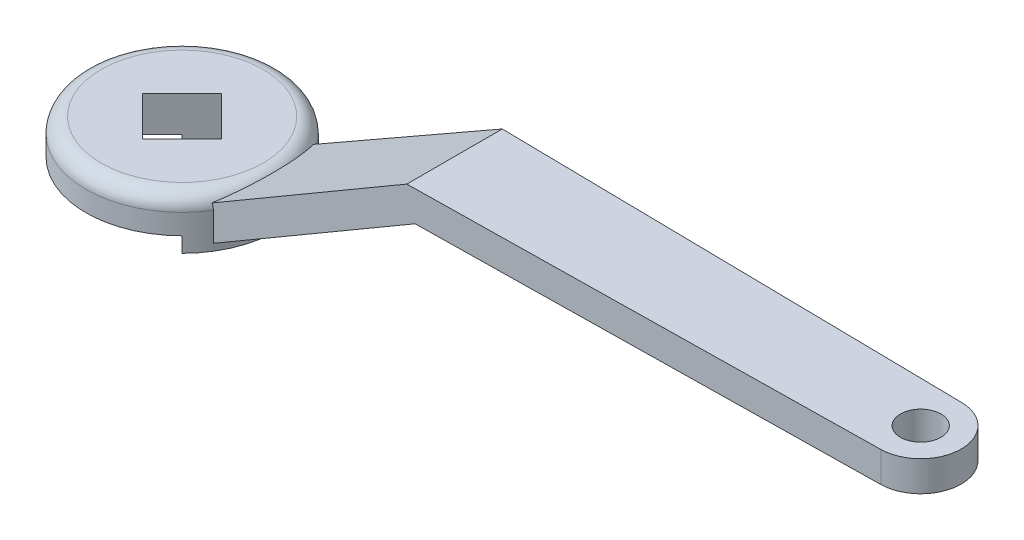
ISO-10303-21;
HEADER;
FILE_DESCRIPTION(('STEP AP214'),'2;1');
FILE_NAME('part.step','',(''),(''),'','','');
FILE_SCHEMA(('AUTOMOTIVE_DESIGN { 1 0 10303 214 1 1 1 1 }'));
ENDSEC;
DATA;
#1=APPLICATION_CONTEXT('core data for automotive mechanical design processes');
#2=APPLICATION_PROTOCOL_DEFINITION('international standard','automotive_design',2000,#1);
#3=PRODUCT_CONTEXT('',#1,'mechanical');
#4=PRODUCT('Part','Part','',(#3));
#5=PRODUCT_RELATED_PRODUCT_CATEGORY('part','',(#4));
#6=PRODUCT_DEFINITION_FORMATION('','',#4);
#7=PRODUCT_DEFINITION_CONTEXT('part definition',#1,'design');
#8=PRODUCT_DEFINITION('design','',#6,#7);
#9=PRODUCT_DEFINITION_SHAPE('','',#8);
#10=(LENGTH_UNIT() NAMED_UNIT(*) SI_UNIT(.MILLI.,.METRE.));
#11=(NAMED_UNIT(*) PLANE_ANGLE_UNIT() SI_UNIT($,.RADIAN.));
#12=(NAMED_UNIT(*) SI_UNIT($,.STERADIAN.) SOLID_ANGLE_UNIT());
#13=UNCERTAINTY_MEASURE_WITH_UNIT(LENGTH_MEASURE(1.E-05),#10,'distance_accuracy_value','');
#14=(GEOMETRIC_REPRESENTATION_CONTEXT(3) GLOBAL_UNCERTAINTY_ASSIGNED_CONTEXT((#13)) GLOBAL_UNIT_ASSIGNED_CONTEXT((#10,
#11,#12)) REPRESENTATION_CONTEXT('',''));
#15=CARTESIAN_POINT('',(0.,0.,0.));
#16=DIRECTION('',(0.,0.,1.));
#17=DIRECTION('',(1.,0.,0.));
#18=AXIS2_PLACEMENT_3D('',#15,#16,#17);
#19=CARTESIAN_POINT('',(-7.77817459305202,0.,0.));
#20=DIRECTION('',(-0.707106781186547,0.,0.707106781186548));
#21=DIRECTION('',(0.707106781186548,0.,0.707106781186547));
#22=AXIS2_PLACEMENT_3D('',#19,#20,#21);
#23=PLANE('',#22);
#24=DIRECTION('',(0.,1.,0.));
#25=VECTOR('',#24,1.);
#26=CARTESIAN_POINT('',(0.,0.,7.77817459305202));
#27=LINE('',#26,#25);
#28=CARTESIAN_POINT('',(0.,3.,7.77817459305202));
#29=VERTEX_POINT('',#28);
#30=CARTESIAN_POINT('',(0.,10.,7.77817459305202));
#31=VERTEX_POINT('',#30);
#32=EDGE_CURVE('E283',#29,#31,#27,.T.);
#33=ORIENTED_EDGE('',*,*,#32,.F.);
#34=DIRECTION('',(-0.707106781186548,0.,-0.707106781186547));
#35=VECTOR('',#34,1.);
#36=CARTESIAN_POINT('',(-3.88908729652601,3.,3.88908729652601));
#37=LINE('',#36,#35);
#38=CARTESIAN_POINT('',(-7.77817459305202,3.,0.));
#39=VERTEX_POINT('',#38);
#40=EDGE_CURVE('E32',#29,#39,#37,.T.);
#41=ORIENTED_EDGE('',*,*,#40,.T.);
#42=DIRECTION('',(0.,1.,0.));
#43=VECTOR('',#42,1.);
#44=CARTESIAN_POINT('',(-7.77817459305202,0.,0.));
#45=LINE('',#44,#43);
#46=CARTESIAN_POINT('',(-7.77817459305202,10.,0.));
#47=VERTEX_POINT('',#46);
#48=EDGE_CURVE('E265',#39,#47,#45,.T.);
#49=ORIENTED_EDGE('',*,*,#48,.T.);
#50=DIRECTION('',(0.707106781186548,0.,0.707106781186547));
#51=VECTOR('',#50,1.);
#52=CARTESIAN_POINT('',(-7.77817459305202,10.,0.));
#53=LINE('',#52,#51);
#54=EDGE_CURVE('E276',#47,#31,#53,.T.);
#55=ORIENTED_EDGE('',*,*,#54,.T.);
#56=EDGE_LOOP('',(#33,#41,#49,#55));
#57=FACE_BOUND('',#56,.T.);
#58=ADVANCED_FACE('F16',(#57),#23,.F.);
#59=CARTESIAN_POINT('',(13.8038475772934,0.,10.));
#60=DIRECTION('',(-0.5,0.866025403784438,0.));
#61=DIRECTION('',(-0.866025403784438,-0.5,0.));
#62=AXIS2_PLACEMENT_3D('',#59,#60,#61);
#63=PLANE('',#62);
#64=DIRECTION('',(0.,0.,-1.));
#65=VECTOR('',#64,1.);
#66=CARTESIAN_POINT('',(55.3730669589463,24.,10.));
#67=LINE('',#66,#65);
#68=CARTESIAN_POINT('',(55.3730669589463,24.,9.39512457310106));
#69=VERTEX_POINT('',#68);
#70=CARTESIAN_POINT('',(55.3730669589463,24.,-9.39512457310106));
#71=VERTEX_POINT('',#70);
#72=EDGE_CURVE('E197',#69,#71,#67,.T.);
#73=ORIENTED_EDGE('',*,*,#72,.F.);
#74=DIRECTION('',(-0.865948158094437,-0.499955402180085,0.0133560220051432));
#75=VECTOR('',#74,1.);
#76=CARTESIAN_POINT('',(13.8042670718738,0.000242195308952484,10.0362643466885));
#77=LINE('',#76,#75);
#78=CARTESIAN_POINT('',(16.1554944214035,1.35772393848592,10.));
#79=VERTEX_POINT('',#78);
#80=EDGE_CURVE('E184',#69,#79,#77,.T.);
#81=ORIENTED_EDGE('',*,*,#80,.T.);
#82=CARTESIAN_POINT('',(0.,-7.96965511460292,0.));
#83=DIRECTION('',(-0.5,0.866025403784438,0.));
#84=DIRECTION('',(-0.866025403784438,-0.5,0.));
#85=AXIS2_PLACEMENT_3D('',#82,#83,#84);
#86=ELLIPSE('',#85,21.9393102292058,19.);
#87=CARTESIAN_POINT('',(16.1554944214035,1.35772393848592,-10.));
#88=VERTEX_POINT('',#87);
#89=EDGE_CURVE('E189',#88,#79,#86,.F.);
#90=ORIENTED_EDGE('',*,*,#89,.F.);
#91=DIRECTION('',(0.865948158094437,0.499955402180085,0.0133560220051432));
#92=VECTOR('',#91,1.);
#93=CARTESIAN_POINT('',(14.0355795249703,0.133790502371101,-10.0326966802125));
#94=LINE('',#93,#92);
#95=EDGE_CURVE('E175',#88,#71,#94,.T.);
#96=ORIENTED_EDGE('',*,*,#95,.T.);
#97=EDGE_LOOP('',(#73,#81,#90,#96));
#98=FACE_BOUND('',#97,.T.);
#99=ADVANCED_FACE('F316',(#98),#63,.F.);
#100=CARTESIAN_POINT('',(55.3730669589463,24.,10.));
#101=DIRECTION('',(0.,1.,0.));
#102=DIRECTION('',(0.,0.,1.));
#103=AXIS2_PLACEMENT_3D('',#100,#101,#102);
#104=PLANE('',#103);
#105=CARTESIAN_POINT('',(145.76537180436,24.,0.));
#106=DIRECTION('',(0.,1.,0.));
#107=DIRECTION('',(0.,0.,1.));
#108=AXIS2_PLACEMENT_3D('',#105,#106,#107);
#109=CIRCLE('',#108,4.);
#110=CARTESIAN_POINT('',(145.76537180436,24.,4.));
#111=VERTEX_POINT('',#110);
#112=EDGE_CURVE('E273',#111,#111,#109,.T.);
#113=ORIENTED_EDGE('',*,*,#112,.T.);
#114=EDGE_LOOP('',(#113));
#115=FACE_BOUND('',#114,.T.);
#116=CARTESIAN_POINT('',(145.76537180436,24.,0.));
#117=DIRECTION('',(0.,1.,0.));
#118=DIRECTION('',(0.,0.,1.));
#119=AXIS2_PLACEMENT_3D('',#116,#117,#118);
#120=CIRCLE('',#119,8.);
#121=CARTESIAN_POINT('',(145.888745782837,24.,-7.9990486222697));
#122=VERTEX_POINT('',#121);
#123=CARTESIAN_POINT('',(145.888745782837,24.,7.9990486222697));
#124=VERTEX_POINT('',#123);
#125=EDGE_CURVE('E187',#122,#124,#120,.F.);
#126=ORIENTED_EDGE('',*,*,#125,.T.);
#127=DIRECTION('',(-0.999881077783712,0.,0.0154217473096689));
#128=VECTOR('',#127,1.);
#129=CARTESIAN_POINT('',(55.3637398322934,24.,9.3952684307993));
#130=LINE('',#129,#128);
#131=EDGE_CURVE('E181',#124,#69,#130,.T.);
#132=ORIENTED_EDGE('',*,*,#131,.T.);
#133=ORIENTED_EDGE('',*,*,#72,.T.);
#134=DIRECTION('',(0.999881077783712,0.,0.0154217473096689));
#135=VECTOR('',#134,1.);
#136=CARTESIAN_POINT('',(55.6721380987193,24.,-9.39051182499764));
#137=LINE('',#136,#135);
#138=EDGE_CURVE('E172',#71,#122,#137,.T.);
#139=ORIENTED_EDGE('',*,*,#138,.T.);
#140=EDGE_LOOP('',(#126,#132,#133,#139));
#141=FACE_BOUND('',#140,.T.);
#142=ADVANCED_FACE('F321',(#115,#141),#104,.F.);
#143=CARTESIAN_POINT('',(53.7653718043596,30.,10.));
#144=DIRECTION('',(0.,-1.,0.));
#145=DIRECTION('',(0.,0.,-1.));
#146=AXIS2_PLACEMENT_3D('',#143,#144,#145);
#147=PLANE('',#146);
#148=CARTESIAN_POINT('',(145.76537180436,30.,0.));
#149=DIRECTION('',(0.,1.,0.));
#150=DIRECTION('',(0.,0.,1.));
#151=AXIS2_PLACEMENT_3D('',#148,#149,#150);
#152=CIRCLE('',#151,4.);
#153=CARTESIAN_POINT('',(145.76537180436,30.,4.));
#154=VERTEX_POINT('',#153);
#155=EDGE_CURVE('E253',#154,#154,#152,.T.);
#156=ORIENTED_EDGE('',*,*,#155,.F.);
#157=EDGE_LOOP('',(#156));
#158=FACE_BOUND('',#157,.T.);
#159=DIRECTION('',(0.,0.,-1.));
#160=VECTOR('',#159,1.);
#161=CARTESIAN_POINT('',(53.7653718043596,30.,10.));
#162=LINE('',#161,#160);
#163=CARTESIAN_POINT('',(53.7653718043595,30.,9.41992099037097));
#164=VERTEX_POINT('',#163);
#165=CARTESIAN_POINT('',(53.7653718043595,30.,-9.41992099037097));
#166=VERTEX_POINT('',#165);
#167=EDGE_CURVE('E194',#164,#166,#162,.T.);
#168=ORIENTED_EDGE('',*,*,#167,.F.);
#169=DIRECTION('',(0.999881077783712,0.,-0.0154217473096689));
#170=VECTOR('',#169,1.);
#171=CARTESIAN_POINT('',(16.1554944214035,30.,10.));
#172=LINE('',#171,#170);
#173=CARTESIAN_POINT('',(145.888745782837,30.,7.9990486222697));
#174=VERTEX_POINT('',#173);
#175=EDGE_CURVE('E150',#164,#174,#172,.T.);
#176=ORIENTED_EDGE('',*,*,#175,.T.);
#177=CARTESIAN_POINT('',(145.76537180436,30.,0.));
#178=DIRECTION('',(0.,1.,0.));
#179=DIRECTION('',(0.,0.,1.));
#180=AXIS2_PLACEMENT_3D('',#177,#178,#179);
#181=CIRCLE('',#180,8.);
#182=CARTESIAN_POINT('',(145.888745782837,30.,-7.99904862226969));
#183=VERTEX_POINT('',#182);
#184=EDGE_CURVE('E154',#174,#183,#181,.T.);
#185=ORIENTED_EDGE('',*,*,#184,.T.);
#186=DIRECTION('',(-0.999881077783712,0.,-0.0154217473096689));
#187=VECTOR('',#186,1.);
#188=CARTESIAN_POINT('',(16.1554944214035,30.,-10.));
#189=LINE('',#188,#187);
#190=EDGE_CURVE('E161',#183,#166,#189,.T.);
#191=ORIENTED_EDGE('',*,*,#190,.T.);
#192=EDGE_LOOP('',(#168,#176,#185,#191));
#193=FACE_BOUND('',#192,.T.);
#194=ADVANCED_FACE('F385',(#158,#193),#147,.F.);
#195=CARTESIAN_POINT('',(10.8038475772934,5.19615242270663,10.));
#196=DIRECTION('',(0.5,-0.866025403784438,0.));
#197=DIRECTION('',(0.866025403784438,0.5,0.));
#198=AXIS2_PLACEMENT_3D('',#195,#196,#197);
#199=PLANE('',#198);
#200=DIRECTION('',(-0.865948158094437,-0.499955402180085,-0.0133560220051432));
#201=VECTOR('',#200,1.);
#202=CARTESIAN_POINT('',(11.0361146749417,5.33025189405778,-10.0789591708318));
#203=LINE('',#202,#201);
#204=CARTESIAN_POINT('',(15.8909461979254,8.13319018072274,-10.0040802810898));
#205=VERTEX_POINT('',#204);
#206=EDGE_CURVE('E170',#166,#205,#203,.T.);
#207=ORIENTED_EDGE('',*,*,#206,.T.);
#208=CARTESIAN_POINT('',(15.8909461979254,8.13319018072274,-10.0040802810898));
#209=CARTESIAN_POINT('',(16.0834714126921,8.24434466529403,-9.6130587844605));
#210=CARTESIAN_POINT('',(16.2600014060128,8.34626430445777,-9.21194413680739));
#211=CARTESIAN_POINT('',(16.5826303672746,8.53253422209069,-8.39450973239651));
#212=CARTESIAN_POINT('',(16.7287821648788,8.61691500177999,-7.97821787762017));
#213=CARTESIAN_POINT('',(16.9928173694254,8.76935579820052,-7.13419768518777));
#214=CARTESIAN_POINT('',(17.1107134026351,8.83742310471049,-6.70647455100184));
#215=CARTESIAN_POINT('',(17.3204025410203,8.95848718520334,-5.84234670886082));
#216=CARTESIAN_POINT('',(17.4121797830036,9.01147480056796,-5.40593689647396));
#217=CARTESIAN_POINT('',(17.5524894099975,9.09248260148273,-4.63230251117251));
#218=CARTESIAN_POINT('',(17.6061149953627,9.12344334762878,-4.29628520625016));
#219=CARTESIAN_POINT('',(17.7001653539011,9.1777433474483,-3.62179448964675));
#220=CARTESIAN_POINT('',(17.7405899512008,9.20108249958117,-3.28332104530456));
#221=CARTESIAN_POINT('',(17.8089558781152,9.24055358588858,-2.60458604487492));
#222=CARTESIAN_POINT('',(17.8368926126035,9.2566828670657,-2.26432387711522));
#223=CARTESIAN_POINT('',(17.8808070723632,9.28203689222929,-1.58278870512594));
#224=CARTESIAN_POINT('',(17.8967851379249,9.29126183268247,-1.24151572993688));
#225=CARTESIAN_POINT('',(17.9171377555138,9.30301242192609,-0.557900570385449));
#226=CARTESIAN_POINT('',(17.9214914945681,9.30552605434109,-0.215557565500221));
#227=CARTESIAN_POINT('',(17.91863089234,9.30387448487468,0.469068033525936));
#228=CARTESIAN_POINT('',(17.9114163717042,9.29970917944349,0.81135062664796));
#229=CARTESIAN_POINT('',(17.8852619770625,9.2846089326566,1.49532980089395));
#230=CARTESIAN_POINT('',(17.8663220848862,9.2736739808102,1.83702638110897));
#231=CARTESIAN_POINT('',(17.8163233558742,9.24480720115602,2.51920770352115));
#232=CARTESIAN_POINT('',(17.7852649130959,9.22687560085736,2.85969248475899));
#233=CARTESIAN_POINT('',(17.6823799155399,9.1674749198228,3.79355840086393));
#234=CARTESIAN_POINT('',(17.5974468791557,9.11843880840332,4.38512331797364));
#235=CARTESIAN_POINT('',(17.3845955626193,8.99554904350362,5.55731908542974));
#236=CARTESIAN_POINT('',(17.256720688729,8.92172045064047,6.13796035417972));
#237=CARTESIAN_POINT('',(16.9535494314653,8.74668444364874,7.28096369922883));
#238=CARTESIAN_POINT('',(16.7784001714134,8.6455619712094,7.84337652210375));
#239=CARTESIAN_POINT('',(16.4763628713548,8.47118065471527,8.66873402066215));
#240=CARTESIAN_POINT('',(16.3689113537378,8.40914349209424,8.94126523575595));
#241=CARTESIAN_POINT('',(16.1403240878773,8.27716857261636,9.47873301386917));
#242=CARTESIAN_POINT('',(16.0191810818879,8.20722662549794,9.74366545466722));
#243=CARTESIAN_POINT('',(15.8909461979254,8.13319018072274,10.0040802810898));
#244=B_SPLINE_CURVE_WITH_KNOTS('',3,(#208,#209,#210,#211,#212,#213,#214,#215,#216,#217,#218,
#219,#220,#221,#222,#223,#224,#225,#226,#227,#228,#229,#230,#231,#232,#233,#234,#235,#236,#237,
#238,#239,#240,#241,#242,#243),.UNSPECIFIED.,.F.,.F.,(4,2,2,2,2,2,2,2,2,2,2,2,2,2,2,2,2,4),(0.,
1.34839413993687,2.69442334392131,4.0398499400718,5.38609194276592,6.41077445589759,
7.43547062006211,8.46054352924317,9.48558726831933,10.5124650874562,11.539358827388,
12.5662541586677,13.5931161013089,15.3899882430721,17.1850495191488,18.9745875172904,
19.8724692877906,20.7708292704307),.UNSPECIFIED.);
#245=CARTESIAN_POINT('',(15.8909461979254,8.13319018072274,10.0040802810898));
#246=VERTEX_POINT('',#245);
#247=EDGE_CURVE('E217',#205,#246,#244,.T.);
#248=ORIENTED_EDGE('',*,*,#247,.T.);
#249=DIRECTION('',(0.865948158094437,0.499955402180085,-0.0133560220051432));
#250=VECTOR('',#249,1.);
#251=CARTESIAN_POINT('',(10.8048022218452,5.19670358699563,10.0825268373078));
#252=LINE('',#251,#250);
#253=EDGE_CURVE('E178',#246,#164,#252,.T.);
#254=ORIENTED_EDGE('',*,*,#253,.T.);
#255=ORIENTED_EDGE('',*,*,#167,.T.);
#256=EDGE_LOOP('',(#207,#248,#254,#255));
#257=FACE_BOUND('',#256,.T.);
#258=ADVANCED_FACE('F235',(#257),#199,.F.);
#259=CARTESIAN_POINT('',(145.76537180436,30.,0.));
#260=DIRECTION('',(0.,-1.,0.));
#261=DIRECTION('',(0.,0.,-1.));
#262=AXIS2_PLACEMENT_3D('',#259,#260,#261);
#263=CYLINDRICAL_SURFACE('',#262,8.);
#264=DIRECTION('',(0.,-1.,0.));
#265=VECTOR('',#264,1.);
#266=CARTESIAN_POINT('',(145.888745782837,30.,-7.9990486222697));
#267=LINE('',#266,#265);
#268=EDGE_CURVE('E164',#183,#122,#267,.T.);
#269=ORIENTED_EDGE('',*,*,#268,.F.);
#270=ORIENTED_EDGE('',*,*,#184,.F.);
#271=DIRECTION('',(0.,-1.,0.));
#272=VECTOR('',#271,1.);
#273=CARTESIAN_POINT('',(145.888745782837,30.,7.9990486222697));
#274=LINE('',#273,#272);
#275=EDGE_CURVE('E167',#174,#124,#274,.T.);
#276=ORIENTED_EDGE('',*,*,#275,.T.);
#277=ORIENTED_EDGE('',*,*,#125,.F.);
#278=EDGE_LOOP('',(#269,#270,#276,#277));
#279=FACE_BOUND('',#278,.T.);
#280=ADVANCED_FACE('F232',(#279),#263,.T.);
#281=CARTESIAN_POINT('',(16.1554944214035,30.,10.));
#282=DIRECTION('',(-0.0154217473096689,0.,-0.999881077783711));
#283=DIRECTION('',(-0.999881077783712,0.,0.0154217473096689));
#284=AXIS2_PLACEMENT_3D('',#281,#282,#283);
#285=PLANE('',#284);
#286=ORIENTED_EDGE('',*,*,#131,.F.);
#287=ORIENTED_EDGE('',*,*,#275,.F.);
#288=ORIENTED_EDGE('',*,*,#175,.F.);
#289=ORIENTED_EDGE('',*,*,#253,.F.);
#290=CARTESIAN_POINT('',(15.8909461979254,8.13319018072274,10.0040802810898));
#291=CARTESIAN_POINT('',(15.9231234605077,8.0671175877894,10.0035839924574));
#292=CARTESIAN_POINT('',(15.9526075077377,7.99971992677659,10.0031292428515));
#293=CARTESIAN_POINT('',(16.005914721615,7.86266221386572,10.0023070546929));
#294=CARTESIAN_POINT('',(16.0297334344068,7.79300043058564,10.0019396848345));
#295=CARTESIAN_POINT('',(16.0709880257975,7.65324910954435,10.0013033912813));
#296=CARTESIAN_POINT('',(16.0885367020204,7.58319291573292,10.001032727843));
#297=CARTESIAN_POINT('',(16.1176551310247,7.44189100302382,10.0005836173797));
#298=CARTESIAN_POINT('',(16.1292290020477,7.37064613849835,10.0004051068365));
#299=CARTESIAN_POINT('',(16.1436332079736,7.24960172651588,10.0001829423922));
#300=CARTESIAN_POINT('',(16.1480608219142,7.19998681785106,10.0001146527277));
#301=CARTESIAN_POINT('',(16.1540024262755,7.10025069666384,10.0000230119085));
#302=CARTESIAN_POINT('',(16.1554967839976,7.05012831450426,9.99999996356033));
#303=CARTESIAN_POINT('',(16.1554944214037,7.,10.));
#304=B_SPLINE_CURVE_WITH_KNOTS('',3,(#290,#291,#292,#293,#294,#295,#296,#297,#298,#299,#300,
#301,#302,#303),.UNSPECIFIED.,.F.,.F.,(4,2,2,2,2,2,4),(0.,0.220436690451543,0.441046110661099,
0.657459024704479,0.873722572423942,1.02307737034331,1.17342845772095),.UNSPECIFIED.);
#305=CARTESIAN_POINT('',(16.1554944214035,7.,10.));
#306=VERTEX_POINT('',#305);
#307=EDGE_CURVE('E242',#246,#306,#304,.T.);
#308=ORIENTED_EDGE('',*,*,#307,.T.);
#309=DIRECTION('',(0.,-1.,0.));
#310=VECTOR('',#309,1.);
#311=CARTESIAN_POINT('',(16.1554944214035,20.,10.));
#312=LINE('',#311,#310);
#313=EDGE_CURVE('E191',#79,#306,#312,.F.);
#314=ORIENTED_EDGE('',*,*,#313,.F.);
#315=ORIENTED_EDGE('',*,*,#80,.F.);
#316=EDGE_LOOP('',(#286,#287,#288,#289,#308,#314,#315));
#317=FACE_BOUND('',#316,.T.);
#318=ADVANCED_FACE('F229',(#317),#285,.F.);
#319=CARTESIAN_POINT('',(16.1554944214035,30.,-10.));
#320=DIRECTION('',(-0.0154217473096689,0.,0.999881077783711));
#321=DIRECTION('',(0.999881077783712,0.,0.0154217473096689));
#322=AXIS2_PLACEMENT_3D('',#319,#320,#321);
#323=PLANE('',#322);
#324=DIRECTION('',(0.,-1.,0.));
#325=VECTOR('',#324,1.);
#326=CARTESIAN_POINT('',(16.1554944214035,20.,-10.));
#327=LINE('',#326,#325);
#328=CARTESIAN_POINT('',(16.1554944214035,7.,-10.));
#329=VERTEX_POINT('',#328);
#330=EDGE_CURVE('E200',#88,#329,#327,.F.);
#331=ORIENTED_EDGE('',*,*,#330,.T.);
#332=CARTESIAN_POINT('',(16.1554944214035,7.,-10.));
#333=CARTESIAN_POINT('',(16.1555095438201,7.07350950492849,-9.99999976675818));
#334=CARTESIAN_POINT('',(16.1522870125196,7.14701513015519,-10.0000494697324));
#335=CARTESIAN_POINT('',(16.1394739627873,7.2934831946519,-10.0002470928494));
#336=CARTESIAN_POINT('',(16.129882311069,7.36644553491598,-10.0003950304715));
#337=CARTESIAN_POINT('',(16.1046733423703,7.50992789061208,-10.0007838430552));
#338=CARTESIAN_POINT('',(16.089170569226,7.58046812622865,-10.0010229513405));
#339=CARTESIAN_POINT('',(16.052333985714,7.71997471604751,-10.0015911033891));
#340=CARTESIAN_POINT('',(16.0310030649457,7.78894183189228,-10.0019201025844));
#341=CARTESIAN_POINT('',(15.9902275108008,7.90384379201965,-10.0025490076676));
#342=CARTESIAN_POINT('',(15.9722411723245,7.95030281961418,-10.0028264214253));
#343=CARTESIAN_POINT('',(15.9335796289699,8.04244449987928,-10.0034227208907));
#344=CARTESIAN_POINT('',(15.9128876811131,8.08812012900517,-10.0037418648352));
#345=CARTESIAN_POINT('',(15.8909461979255,8.13319018072276,-10.0040802810898));
#346=B_SPLINE_CURVE_WITH_KNOTS('',3,(#332,#333,#334,#335,#336,#337,#338,#339,#340,#341,#342,
#343,#344,#345),.UNSPECIFIED.,.F.,.F.,(4,2,2,2,2,2,4),(0.,0.220452402521293,0.440944041650336,
0.657363971099389,0.873676793502128,1.02306361111987,1.17342298079601),.UNSPECIFIED.);
#347=EDGE_CURVE('E209',#329,#205,#346,.T.);
#348=ORIENTED_EDGE('',*,*,#347,.T.);
#349=ORIENTED_EDGE('',*,*,#206,.F.);
#350=ORIENTED_EDGE('',*,*,#190,.F.);
#351=ORIENTED_EDGE('',*,*,#268,.T.);
#352=ORIENTED_EDGE('',*,*,#138,.F.);
#353=ORIENTED_EDGE('',*,*,#95,.F.);
#354=EDGE_LOOP('',(#331,#348,#349,#350,#351,#352,#353));
#355=FACE_BOUND('',#354,.T.);
#356=ADVANCED_FACE('F224',(#355),#323,.F.);
#357=CARTESIAN_POINT('',(0.,10.,0.));
#358=DIRECTION('',(0.,-1.,0.));
#359=DIRECTION('',(0.,0.,-1.));
#360=AXIS2_PLACEMENT_3D('',#357,#358,#359);
#361=CYLINDRICAL_SURFACE('',#360,19.);
#362=CARTESIAN_POINT('',(0.,3.,0.));
#363=DIRECTION('',(0.,-1.,0.));
#364=DIRECTION('',(0.,0.,-1.));
#365=AXIS2_PLACEMENT_3D('',#362,#363,#364);
#366=CIRCLE('',#365,19.);
#367=CARTESIAN_POINT('',(13.4350288425445,3.,13.4350288425443));
#368=VERTEX_POINT('',#367);
#369=CARTESIAN_POINT('',(-13.4350288425445,3.,-13.4350288425443));
#370=VERTEX_POINT('',#369);
#371=EDGE_CURVE('E142',#368,#370,#366,.T.);
#372=ORIENTED_EDGE('',*,*,#371,.F.);
#373=DIRECTION('',(0.,-1.,0.));
#374=VECTOR('',#373,1.);
#375=CARTESIAN_POINT('',(13.4350288425445,48.8700576850888,13.4350288425443));
#376=LINE('',#375,#374);
#377=CARTESIAN_POINT('',(13.4350288425445,0.,13.4350288425443));
#378=VERTEX_POINT('',#377);
#379=EDGE_CURVE('E129',#368,#378,#376,.T.);
#380=ORIENTED_EDGE('',*,*,#379,.T.);
#381=CARTESIAN_POINT('',(0.,0.,0.));
#382=DIRECTION('',(0.,1.,0.));
#383=DIRECTION('',(0.,0.,1.));
#384=AXIS2_PLACEMENT_3D('',#381,#382,#383);
#385=CIRCLE('',#384,19.);
#386=CARTESIAN_POINT('',(-13.4350288425445,0.,-13.4350288425443));
#387=VERTEX_POINT('',#386);
#388=EDGE_CURVE('E139',#378,#387,#385,.T.);
#389=ORIENTED_EDGE('',*,*,#388,.T.);
#390=DIRECTION('',(0.,-1.,0.));
#391=VECTOR('',#390,1.);
#392=CARTESIAN_POINT('',(-13.4350288425445,3.,-13.4350288425443));
#393=LINE('',#392,#391);
#394=EDGE_CURVE('E151',#370,#387,#393,.T.);
#395=ORIENTED_EDGE('',*,*,#394,.F.);
#396=EDGE_LOOP('',(#372,#380,#389,#395));
#397=FACE_BOUND('',#396,.T.);
#398=ORIENTED_EDGE('',*,*,#313,.T.);
#399=CARTESIAN_POINT('',(0.,7.,0.));
#400=DIRECTION('',(0.,1.,0.));
#401=DIRECTION('',(0.,0.,1.));
#402=AXIS2_PLACEMENT_3D('',#399,#400,#401);
#403=CIRCLE('',#402,19.);
#404=EDGE_CURVE('E206',#306,#329,#403,.F.);
#405=ORIENTED_EDGE('',*,*,#404,.T.);
#406=ORIENTED_EDGE('',*,*,#330,.F.);
#407=ORIENTED_EDGE('',*,*,#89,.T.);
#408=EDGE_LOOP('',(#398,#405,#406,#407));
#409=FACE_BOUND('',#408,.T.);
#410=ADVANCED_FACE('F136',(#397,#409),#361,.T.);
#411=CARTESIAN_POINT('',(0.,10.,0.));
#412=DIRECTION('',(0.,1.,0.));
#413=DIRECTION('',(0.,0.,1.));
#414=AXIS2_PLACEMENT_3D('',#411,#412,#413);
#415=PLANE('',#414);
#416=DIRECTION('',(-0.707106781186548,0.,-0.707106781186547));
#417=VECTOR('',#416,1.);
#418=CARTESIAN_POINT('',(7.77817459305202,10.,0.));
#419=LINE('',#418,#417);
#420=CARTESIAN_POINT('',(7.77817459305202,10.,0.));
#421=VERTEX_POINT('',#420);
#422=CARTESIAN_POINT('',(0.,10.,-7.77817459305202));
#423=VERTEX_POINT('',#422);
#424=EDGE_CURVE('E40',#421,#423,#419,.T.);
#425=ORIENTED_EDGE('',*,*,#424,.F.);
#426=DIRECTION('',(0.707106781186547,0.,-0.707106781186548));
#427=VECTOR('',#426,1.);
#428=CARTESIAN_POINT('',(0.,10.,7.77817459305202));
#429=LINE('',#428,#427);
#430=EDGE_CURVE('E279',#31,#421,#429,.T.);
#431=ORIENTED_EDGE('',*,*,#430,.F.);
#432=ORIENTED_EDGE('',*,*,#54,.F.);
#433=DIRECTION('',(-0.707106781186547,0.,0.707106781186548));
#434=VECTOR('',#433,1.);
#435=CARTESIAN_POINT('',(0.,10.,-7.77817459305202));
#436=LINE('',#435,#434);
#437=EDGE_CURVE('E272',#423,#47,#436,.T.);
#438=ORIENTED_EDGE('',*,*,#437,.F.);
#439=EDGE_LOOP('',(#425,#431,#432,#438));
#440=FACE_BOUND('',#439,.T.);
#441=CARTESIAN_POINT('',(0.,10.,0.));
#442=DIRECTION('',(0.,1.,0.));
#443=DIRECTION('',(0.,0.,1.));
#444=AXIS2_PLACEMENT_3D('',#441,#442,#443);
#445=CIRCLE('',#444,16.);
#446=CARTESIAN_POINT('',(0.,10.,16.));
#447=VERTEX_POINT('',#446);
#448=EDGE_CURVE('E203',#447,#447,#445,.T.);
#449=ORIENTED_EDGE('',*,*,#448,.T.);
#450=EDGE_LOOP('',(#449));
#451=FACE_BOUND('',#450,.T.);
#452=ADVANCED_FACE('F301',(#440,#451),#415,.T.);
#453=CARTESIAN_POINT('',(0.,0.,0.));
#454=DIRECTION('',(0.,1.,0.));
#455=DIRECTION('',(0.,0.,1.));
#456=AXIS2_PLACEMENT_3D('',#453,#454,#455);
#457=PLANE('',#456);
#458=ORIENTED_EDGE('',*,*,#388,.F.);
#459=DIRECTION('',(0.707106781186552,0.,0.707106781186544));
#460=VECTOR('',#459,1.);
#461=CARTESIAN_POINT('',(-13.4350288425445,0.,-13.4350288425443));
#462=LINE('',#461,#460);
#463=CARTESIAN_POINT('',(3.88908729652603,0.,3.88908729652599));
#464=VERTEX_POINT('',#463);
#465=EDGE_CURVE('E125',#464,#378,#462,.T.);
#466=ORIENTED_EDGE('',*,*,#465,.F.);
#467=DIRECTION('',(0.707106781186547,0.,-0.707106781186548));
#468=VECTOR('',#467,1.);
#469=CARTESIAN_POINT('',(0.,0.,7.77817459305202));
#470=LINE('',#469,#468);
#471=CARTESIAN_POINT('',(7.77817459305202,0.,0.));
#472=VERTEX_POINT('',#471);
#473=EDGE_CURVE('E257',#464,#472,#470,.T.);
#474=ORIENTED_EDGE('',*,*,#473,.T.);
#475=DIRECTION('',(-0.707106781186548,0.,-0.707106781186547));
#476=VECTOR('',#475,1.);
#477=CARTESIAN_POINT('',(7.77817459305202,0.,0.));
#478=LINE('',#477,#476);
#479=CARTESIAN_POINT('',(0.,0.,-7.77817459305202));
#480=VERTEX_POINT('',#479);
#481=EDGE_CURVE('E267',#472,#480,#478,.T.);
#482=ORIENTED_EDGE('',*,*,#481,.T.);
#483=DIRECTION('',(-0.707106781186547,0.,0.707106781186548));
#484=VECTOR('',#483,1.);
#485=CARTESIAN_POINT('',(0.,0.,-7.77817459305202));
#486=LINE('',#485,#484);
#487=CARTESIAN_POINT('',(-3.88908729652603,0.,-3.88908729652599));
#488=VERTEX_POINT('',#487);
#489=EDGE_CURVE('E263',#480,#488,#486,.T.);
#490=ORIENTED_EDGE('',*,*,#489,.T.);
#491=DIRECTION('',(0.707106781186552,0.,0.707106781186544));
#492=VECTOR('',#491,1.);
#493=CARTESIAN_POINT('',(0.,0.,0.));
#494=LINE('',#493,#492);
#495=EDGE_CURVE('E149',#387,#488,#494,.T.);
#496=ORIENTED_EDGE('',*,*,#495,.F.);
#497=EDGE_LOOP('',(#458,#466,#474,#482,#490,#496));
#498=FACE_BOUND('',#497,.T.);
#499=ADVANCED_FACE('F146',(#498),#457,.F.);
#500=CARTESIAN_POINT('',(0.,7.,0.));
#501=DIRECTION('',(0.,1.,0.));
#502=DIRECTION('',(0.,0.,1.));
#503=AXIS2_PLACEMENT_3D('',#500,#501,#502);
#504=TOROIDAL_SURFACE('',#503,16.,3.);
#505=ORIENTED_EDGE('',*,*,#347,.F.);
#506=ORIENTED_EDGE('',*,*,#404,.F.);
#507=ORIENTED_EDGE('',*,*,#307,.F.);
#508=ORIENTED_EDGE('',*,*,#247,.F.);
#509=EDGE_LOOP('',(#505,#506,#507,#508));
#510=FACE_BOUND('',#509,.T.);
#511=ORIENTED_EDGE('',*,*,#448,.F.);
#512=EDGE_LOOP('',(#511));
#513=FACE_BOUND('',#512,.T.);
#514=ADVANCED_FACE('F18',(#510,#513),#504,.T.);
#515=CARTESIAN_POINT('',(0.,3.,0.));
#516=DIRECTION('',(0.707106781186544,0.,-0.707106781186551));
#517=DIRECTION('',(-0.707106781186552,0.,-0.707106781186544));
#518=AXIS2_PLACEMENT_3D('',#515,#516,#517);
#519=PLANE('',#518);
#520=ORIENTED_EDGE('',*,*,#495,.T.);
#521=DIRECTION('',(0.,1.,0.));
#522=VECTOR('',#521,1.);
#523=CARTESIAN_POINT('',(-3.88908729652603,3.,-3.88908729652599));
#524=LINE('',#523,#522);
#525=CARTESIAN_POINT('',(-3.88908729652603,3.,-3.88908729652599));
#526=VERTEX_POINT('',#525);
#527=EDGE_CURVE('E282',#488,#526,#524,.T.);
#528=ORIENTED_EDGE('',*,*,#527,.T.);
#529=DIRECTION('',(0.707106781186552,0.,0.707106781186544));
#530=VECTOR('',#529,1.);
#531=CARTESIAN_POINT('',(0.,3.,0.));
#532=LINE('',#531,#530);
#533=EDGE_CURVE('E288',#370,#526,#532,.T.);
#534=ORIENTED_EDGE('',*,*,#533,.F.);
#535=ORIENTED_EDGE('',*,*,#394,.T.);
#536=EDGE_LOOP('',(#520,#528,#534,#535));
#537=FACE_BOUND('',#536,.T.);
#538=ADVANCED_FACE('F292',(#537),#519,.F.);
#539=CARTESIAN_POINT('',(0.,3.,0.));
#540=DIRECTION('',(0.,-1.,0.));
#541=DIRECTION('',(0.,0.,-1.));
#542=AXIS2_PLACEMENT_3D('',#539,#540,#541);
#543=PLANE('',#542);
#544=ORIENTED_EDGE('',*,*,#40,.F.);
#545=DIRECTION('',(0.707106781186547,0.,-0.707106781186548));
#546=VECTOR('',#545,1.);
#547=CARTESIAN_POINT('',(0.,3.,7.77817459305202));
#548=LINE('',#547,#546);
#549=CARTESIAN_POINT('',(3.88908729652603,3.,3.88908729652599));
#550=VERTEX_POINT('',#549);
#551=EDGE_CURVE('E25',#29,#550,#548,.T.);
#552=ORIENTED_EDGE('',*,*,#551,.T.);
#553=DIRECTION('',(-0.707106781186552,0.,-0.707106781186544));
#554=VECTOR('',#553,1.);
#555=CARTESIAN_POINT('',(-13.4350288425445,3.,-13.4350288425443));
#556=LINE('',#555,#554);
#557=EDGE_CURVE('E143',#368,#550,#556,.T.);
#558=ORIENTED_EDGE('',*,*,#557,.F.);
#559=ORIENTED_EDGE('',*,*,#371,.T.);
#560=ORIENTED_EDGE('',*,*,#533,.T.);
#561=DIRECTION('',(0.707106781186547,0.,-0.707106781186548));
#562=VECTOR('',#561,1.);
#563=CARTESIAN_POINT('',(-3.88908729652601,3.,-3.88908729652601));
#564=LINE('',#563,#562);
#565=EDGE_CURVE('E248',#39,#526,#564,.T.);
#566=ORIENTED_EDGE('',*,*,#565,.F.);
#567=EDGE_LOOP('',(#544,#552,#558,#559,#560,#566));
#568=FACE_BOUND('',#567,.T.);
#569=ADVANCED_FACE('F250',(#568),#543,.T.);
#570=CARTESIAN_POINT('',(0.,0.,-7.77817459305202));
#571=DIRECTION('',(-0.707106781186548,0.,-0.707106781186547));
#572=DIRECTION('',(-0.707106781186547,0.,0.707106781186548));
#573=AXIS2_PLACEMENT_3D('',#570,#571,#572);
#574=PLANE('',#573);
#575=ORIENTED_EDGE('',*,*,#489,.F.);
#576=DIRECTION('',(0.,1.,0.));
#577=VECTOR('',#576,1.);
#578=CARTESIAN_POINT('',(0.,0.,-7.77817459305202));
#579=LINE('',#578,#577);
#580=EDGE_CURVE('E262',#480,#423,#579,.T.);
#581=ORIENTED_EDGE('',*,*,#580,.T.);
#582=ORIENTED_EDGE('',*,*,#437,.T.);
#583=ORIENTED_EDGE('',*,*,#48,.F.);
#584=ORIENTED_EDGE('',*,*,#565,.T.);
#585=ORIENTED_EDGE('',*,*,#527,.F.);
#586=EDGE_LOOP('',(#575,#581,#582,#583,#584,#585));
#587=FACE_BOUND('',#586,.T.);
#588=ADVANCED_FACE('F295',(#587),#574,.F.);
#589=CARTESIAN_POINT('',(7.77817459305202,0.,0.));
#590=DIRECTION('',(0.707106781186547,0.,-0.707106781186548));
#591=DIRECTION('',(-0.707106781186548,0.,-0.707106781186547));
#592=AXIS2_PLACEMENT_3D('',#589,#590,#591);
#593=PLANE('',#592);
#594=ORIENTED_EDGE('',*,*,#424,.T.);
#595=ORIENTED_EDGE('',*,*,#580,.F.);
#596=ORIENTED_EDGE('',*,*,#481,.F.);
#597=DIRECTION('',(0.,1.,0.));
#598=VECTOR('',#597,1.);
#599=CARTESIAN_POINT('',(7.77817459305202,0.,0.));
#600=LINE('',#599,#598);
#601=EDGE_CURVE('E259',#472,#421,#600,.T.);
#602=ORIENTED_EDGE('',*,*,#601,.T.);
#603=EDGE_LOOP('',(#594,#595,#596,#602));
#604=FACE_BOUND('',#603,.T.);
#605=ADVANCED_FACE('F328',(#604),#593,.F.);
#606=CARTESIAN_POINT('',(0.,0.,7.77817459305202));
#607=DIRECTION('',(0.707106781186548,0.,0.707106781186547));
#608=DIRECTION('',(0.707106781186547,0.,-0.707106781186548));
#609=AXIS2_PLACEMENT_3D('',#606,#607,#608);
#610=PLANE('',#609);
#611=ORIENTED_EDGE('',*,*,#473,.F.);
#612=DIRECTION('',(0.,1.,0.));
#613=VECTOR('',#612,1.);
#614=CARTESIAN_POINT('',(3.88908729652604,0.,3.88908729652599));
#615=LINE('',#614,#613);
#616=EDGE_CURVE('E11',#464,#550,#615,.T.);
#617=ORIENTED_EDGE('',*,*,#616,.T.);
#618=ORIENTED_EDGE('',*,*,#551,.F.);
#619=ORIENTED_EDGE('',*,*,#32,.T.);
#620=ORIENTED_EDGE('',*,*,#430,.T.);
#621=ORIENTED_EDGE('',*,*,#601,.F.);
#622=EDGE_LOOP('',(#611,#617,#618,#619,#620,#621));
#623=FACE_BOUND('',#622,.T.);
#624=ADVANCED_FACE('F255',(#623),#610,.F.);
#625=CARTESIAN_POINT('',(145.76537180436,20.,0.));
#626=DIRECTION('',(0.,1.,0.));
#627=DIRECTION('',(0.,0.,1.));
#628=AXIS2_PLACEMENT_3D('',#625,#626,#627);
#629=CYLINDRICAL_SURFACE('',#628,4.);
#630=ORIENTED_EDGE('',*,*,#155,.T.);
#631=EDGE_LOOP('',(#630));
#632=FACE_BOUND('',#631,.T.);
#633=ORIENTED_EDGE('',*,*,#112,.F.);
#634=EDGE_LOOP('',(#633));
#635=FACE_BOUND('',#634,.T.);
#636=ADVANCED_FACE('F355',(#632,#635),#629,.F.);
#637=CARTESIAN_POINT('',(-13.4350288425445,48.8700576850888,-13.4350288425443));
#638=DIRECTION('',(0.707106781186544,0.,-0.707106781186552));
#639=DIRECTION('',(-0.707106781186552,0.,-0.707106781186544));
#640=AXIS2_PLACEMENT_3D('',#637,#638,#639);
#641=PLANE('',#640);
#642=ORIENTED_EDGE('',*,*,#465,.T.);
#643=ORIENTED_EDGE('',*,*,#379,.F.);
#644=ORIENTED_EDGE('',*,*,#557,.T.);
#645=ORIENTED_EDGE('',*,*,#616,.F.);
#646=EDGE_LOOP('',(#642,#643,#644,#645));
#647=FACE_BOUND('',#646,.T.);
#648=ADVANCED_FACE('F127',(#647),#641,.F.);
#649=CLOSED_SHELL('',(#58,#99,#142,#194,#258,#280,#318,#356,#410,#452,#499,#514,#538,#569,#588,
#605,#624,#636,#648));
#650=MANIFOLD_SOLID_BREP('B1',#649);
#651=ADVANCED_BREP_SHAPE_REPRESENTATION('',(#18,#650),#14);
#652=SHAPE_DEFINITION_REPRESENTATION(#9,#651);
ENDSEC;
END-ISO-10303-21;
